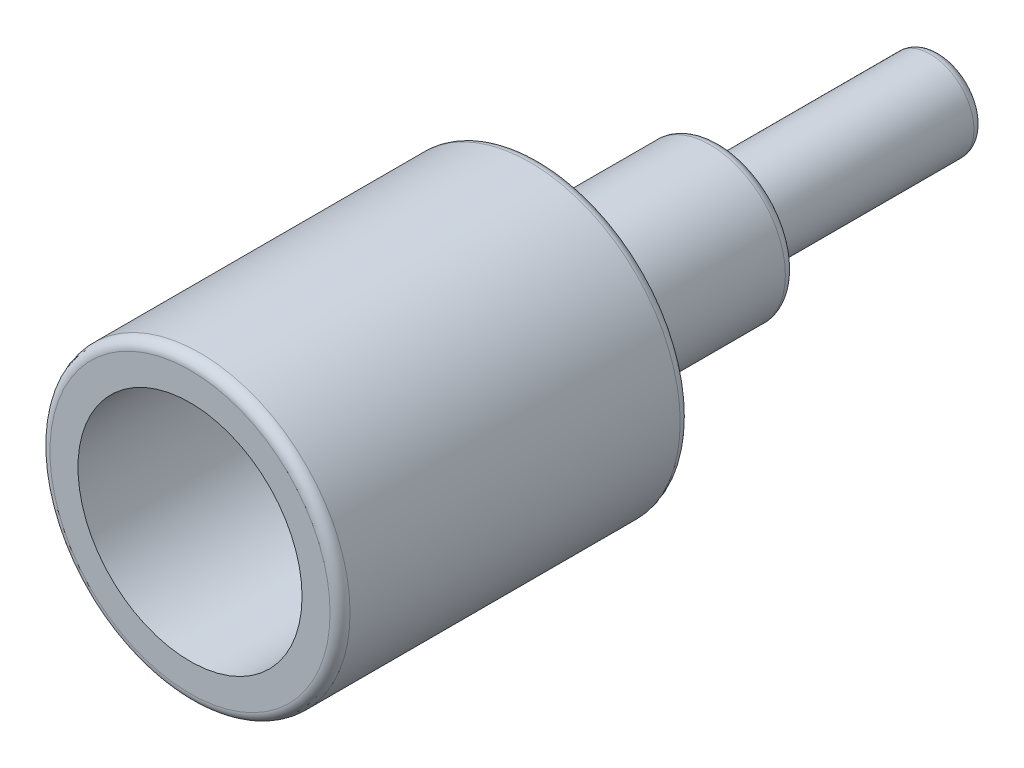
ISO-10303-21;
HEADER;
FILE_DESCRIPTION(('STEP AP214'),'2;1');
FILE_NAME('part.step','',(''),(''),'','','');
FILE_SCHEMA(('AUTOMOTIVE_DESIGN { 1 0 10303 214 1 1 1 1 }'));
ENDSEC;
DATA;
#1=APPLICATION_CONTEXT('core data for automotive mechanical design processes');
#2=APPLICATION_PROTOCOL_DEFINITION('international standard','automotive_design',2000,#1);
#3=PRODUCT_CONTEXT('',#1,'mechanical');
#4=PRODUCT('Part','Part','',(#3));
#5=PRODUCT_RELATED_PRODUCT_CATEGORY('part','',(#4));
#6=PRODUCT_DEFINITION_FORMATION('','',#4);
#7=PRODUCT_DEFINITION_CONTEXT('part definition',#1,'design');
#8=PRODUCT_DEFINITION('design','',#6,#7);
#9=PRODUCT_DEFINITION_SHAPE('','',#8);
#10=(LENGTH_UNIT() NAMED_UNIT(*) SI_UNIT(.MILLI.,.METRE.));
#11=(NAMED_UNIT(*) PLANE_ANGLE_UNIT() SI_UNIT($,.RADIAN.));
#12=(NAMED_UNIT(*) SI_UNIT($,.STERADIAN.) SOLID_ANGLE_UNIT());
#13=UNCERTAINTY_MEASURE_WITH_UNIT(LENGTH_MEASURE(1.E-05),#10,'distance_accuracy_value','');
#14=(GEOMETRIC_REPRESENTATION_CONTEXT(3) GLOBAL_UNCERTAINTY_ASSIGNED_CONTEXT((#13)) GLOBAL_UNIT_ASSIGNED_CONTEXT((#10,
#11,#12)) REPRESENTATION_CONTEXT('',''));
#15=CARTESIAN_POINT('',(0.,0.,0.));
#16=DIRECTION('',(0.,0.,1.));
#17=DIRECTION('',(1.,0.,0.));
#18=AXIS2_PLACEMENT_3D('',#15,#16,#17);
#19=CARTESIAN_POINT('',(0.,0.,3.5));
#20=DIRECTION('',(0.,0.,-1.));
#21=DIRECTION('',(-1.,0.,0.));
#22=AXIS2_PLACEMENT_3D('',#19,#20,#21);
#23=CYLINDRICAL_SURFACE('',#22,1.5);
#24=CARTESIAN_POINT('',(0.,0.,3.4));
#25=DIRECTION('',(0.,0.,1.));
#26=DIRECTION('',(1.,0.,0.));
#27=AXIS2_PLACEMENT_3D('',#24,#25,#26);
#28=CIRCLE('',#27,1.5);
#29=CARTESIAN_POINT('',(1.5,0.,3.4));
#30=VERTEX_POINT('',#29);
#31=EDGE_CURVE('E81',#30,#30,#28,.F.);
#32=ORIENTED_EDGE('',*,*,#31,.T.);
#33=EDGE_LOOP('',(#32));
#34=FACE_BOUND('',#33,.T.);
#35=CARTESIAN_POINT('',(0.,0.,0.0999999999999998));
#36=DIRECTION('',(0.,0.,1.));
#37=DIRECTION('',(1.,0.,0.));
#38=AXIS2_PLACEMENT_3D('',#35,#36,#37);
#39=CIRCLE('',#38,1.5);
#40=CARTESIAN_POINT('',(1.5,0.,0.0999999999999998));
#41=VERTEX_POINT('',#40);
#42=EDGE_CURVE('E85',#41,#41,#39,.T.);
#43=ORIENTED_EDGE('',*,*,#42,.T.);
#44=EDGE_LOOP('',(#43));
#45=FACE_BOUND('',#44,.T.);
#46=ADVANCED_FACE('F37',(#34,#45),#23,.T.);
#47=CARTESIAN_POINT('',(0.,0.,3.5));
#48=DIRECTION('',(0.,0.,1.));
#49=DIRECTION('',(1.,0.,0.));
#50=AXIS2_PLACEMENT_3D('',#47,#48,#49);
#51=PLANE('',#50);
#52=CARTESIAN_POINT('',(0.,0.,3.5));
#53=DIRECTION('',(0.,0.,1.));
#54=DIRECTION('',(1.,0.,0.));
#55=AXIS2_PLACEMENT_3D('',#52,#53,#54);
#56=CIRCLE('',#55,1.4);
#57=CARTESIAN_POINT('',(1.4,0.,3.5));
#58=VERTEX_POINT('',#57);
#59=EDGE_CURVE('E89',#58,#58,#56,.T.);
#60=ORIENTED_EDGE('',*,*,#59,.T.);
#61=EDGE_LOOP('',(#60));
#62=FACE_BOUND('',#61,.T.);
#63=CARTESIAN_POINT('',(0.,0.,3.5));
#64=DIRECTION('',(0.,0.,1.));
#65=DIRECTION('',(1.,0.,0.));
#66=AXIS2_PLACEMENT_3D('',#63,#64,#65);
#67=CIRCLE('',#66,1.12);
#68=CARTESIAN_POINT('',(1.12,0.,3.5));
#69=VERTEX_POINT('',#68);
#70=EDGE_CURVE('E94',#69,#69,#67,.T.);
#71=ORIENTED_EDGE('',*,*,#70,.F.);
#72=EDGE_LOOP('',(#71));
#73=FACE_BOUND('',#72,.T.);
#74=ADVANCED_FACE('F111',(#62,#73),#51,.T.);
#75=CARTESIAN_POINT('',(0.,0.,0.));
#76=DIRECTION('',(0.,0.,1.));
#77=DIRECTION('',(1.,0.,0.));
#78=AXIS2_PLACEMENT_3D('',#75,#76,#77);
#79=PLANE('',#78);
#80=CARTESIAN_POINT('',(0.,0.,0.));
#81=DIRECTION('',(0.,0.,1.));
#82=DIRECTION('',(1.,0.,0.));
#83=AXIS2_PLACEMENT_3D('',#80,#81,#82);
#84=CIRCLE('',#83,1.4);
#85=CARTESIAN_POINT('',(1.4,0.,0.));
#86=VERTEX_POINT('',#85);
#87=EDGE_CURVE('E10',#86,#86,#84,.F.);
#88=ORIENTED_EDGE('',*,*,#87,.T.);
#89=EDGE_LOOP('',(#88));
#90=FACE_BOUND('',#89,.T.);
#91=CARTESIAN_POINT('',(0.,0.,0.));
#92=DIRECTION('',(0.,0.,1.));
#93=DIRECTION('',(1.,0.,0.));
#94=AXIS2_PLACEMENT_3D('',#91,#92,#93);
#95=CIRCLE('',#94,0.8515);
#96=CARTESIAN_POINT('',(0.8515,0.,0.));
#97=VERTEX_POINT('',#96);
#98=EDGE_CURVE('E45',#97,#97,#95,.T.);
#99=ORIENTED_EDGE('',*,*,#98,.T.);
#100=EDGE_LOOP('',(#99));
#101=FACE_BOUND('',#100,.T.);
#102=ADVANCED_FACE('F107',(#90,#101),#79,.F.);
#103=CARTESIAN_POINT('',(0.,0.,0.5));
#104=DIRECTION('',(0.,0.,1.));
#105=DIRECTION('',(1.,0.,0.));
#106=AXIS2_PLACEMENT_3D('',#103,#104,#105);
#107=CYLINDRICAL_SURFACE('',#106,1.12);
#108=CARTESIAN_POINT('',(0.,0.,0.5));
#109=DIRECTION('',(0.,0.,1.));
#110=DIRECTION('',(1.,0.,0.));
#111=AXIS2_PLACEMENT_3D('',#108,#109,#110);
#112=CIRCLE('',#111,1.12);
#113=CARTESIAN_POINT('',(1.12,0.,0.5));
#114=VERTEX_POINT('',#113);
#115=EDGE_CURVE('E93',#114,#114,#112,.T.);
#116=ORIENTED_EDGE('',*,*,#115,.F.);
#117=EDGE_LOOP('',(#116));
#118=FACE_BOUND('',#117,.T.);
#119=ORIENTED_EDGE('',*,*,#70,.T.);
#120=EDGE_LOOP('',(#119));
#121=FACE_BOUND('',#120,.T.);
#122=ADVANCED_FACE('F104',(#118,#121),#107,.F.);
#123=CARTESIAN_POINT('',(0.,0.,0.5));
#124=DIRECTION('',(0.,0.,1.));
#125=DIRECTION('',(1.,0.,0.));
#126=AXIS2_PLACEMENT_3D('',#123,#124,#125);
#127=PLANE('',#126);
#128=ORIENTED_EDGE('',*,*,#115,.T.);
#129=EDGE_LOOP('',(#128));
#130=FACE_BOUND('',#129,.T.);
#131=ADVANCED_FACE('F102',(#130),#127,.T.);
#132=CARTESIAN_POINT('',(0.,0.,-1.8));
#133=DIRECTION('',(0.,0.,1.));
#134=DIRECTION('',(1.,0.,0.));
#135=AXIS2_PLACEMENT_3D('',#132,#133,#134);
#136=CYLINDRICAL_SURFACE('',#135,0.7515);
#137=CARTESIAN_POINT('',(0.,0.,-1.7));
#138=DIRECTION('',(0.,0.,-1.));
#139=DIRECTION('',(-1.,0.,0.));
#140=AXIS2_PLACEMENT_3D('',#137,#138,#139);
#141=CIRCLE('',#140,0.7515);
#142=CARTESIAN_POINT('',(-0.7515,0.,-1.7));
#143=VERTEX_POINT('',#142);
#144=EDGE_CURVE('E50',#143,#143,#141,.F.);
#145=ORIENTED_EDGE('',*,*,#144,.T.);
#146=EDGE_LOOP('',(#145));
#147=FACE_BOUND('',#146,.T.);
#148=CARTESIAN_POINT('',(0.,0.,-0.1));
#149=DIRECTION('',(0.,0.,1.));
#150=DIRECTION('',(1.,0.,0.));
#151=AXIS2_PLACEMENT_3D('',#148,#149,#150);
#152=CIRCLE('',#151,0.7515);
#153=CARTESIAN_POINT('',(0.7515,0.,-0.1));
#154=VERTEX_POINT('',#153);
#155=EDGE_CURVE('E55',#154,#154,#152,.F.);
#156=ORIENTED_EDGE('',*,*,#155,.T.);
#157=EDGE_LOOP('',(#156));
#158=FACE_BOUND('',#157,.T.);
#159=ADVANCED_FACE('F162',(#147,#158),#136,.T.);
#160=CARTESIAN_POINT('',(0.,0.,-1.8));
#161=DIRECTION('',(0.,0.,-1.));
#162=DIRECTION('',(-1.,0.,0.));
#163=AXIS2_PLACEMENT_3D('',#160,#161,#162);
#164=PLANE('',#163);
#165=CARTESIAN_POINT('',(0.,0.,-1.8));
#166=DIRECTION('',(0.,0.,-1.));
#167=DIRECTION('',(-1.,0.,0.));
#168=AXIS2_PLACEMENT_3D('',#165,#166,#167);
#169=CIRCLE('',#168,0.6515);
#170=CARTESIAN_POINT('',(-0.6515,0.,-1.8));
#171=VERTEX_POINT('',#170);
#172=EDGE_CURVE('E61',#171,#171,#169,.T.);
#173=ORIENTED_EDGE('',*,*,#172,.T.);
#174=EDGE_LOOP('',(#173));
#175=FACE_BOUND('',#174,.T.);
#176=CARTESIAN_POINT('',(0.,0.,-1.8));
#177=DIRECTION('',(0.,0.,-1.));
#178=DIRECTION('',(-1.,0.,0.));
#179=AXIS2_PLACEMENT_3D('',#176,#177,#178);
#180=CIRCLE('',#179,0.5365);
#181=CARTESIAN_POINT('',(-0.5365,0.,-1.8));
#182=VERTEX_POINT('',#181);
#183=EDGE_CURVE('E65',#182,#182,#180,.F.);
#184=ORIENTED_EDGE('',*,*,#183,.T.);
#185=EDGE_LOOP('',(#184));
#186=FACE_BOUND('',#185,.T.);
#187=ADVANCED_FACE('F153',(#175,#186),#164,.T.);
#188=CARTESIAN_POINT('',(0.,0.,-4.));
#189=DIRECTION('',(0.,0.,1.));
#190=DIRECTION('',(1.,0.,0.));
#191=AXIS2_PLACEMENT_3D('',#188,#189,#190);
#192=CYLINDRICAL_SURFACE('',#191,0.4365);
#193=CARTESIAN_POINT('',(0.,0.,-3.9));
#194=DIRECTION('',(0.,0.,-1.));
#195=DIRECTION('',(-1.,0.,0.));
#196=AXIS2_PLACEMENT_3D('',#193,#194,#195);
#197=CIRCLE('',#196,0.4365);
#198=CARTESIAN_POINT('',(-0.4365,0.,-3.9));
#199=VERTEX_POINT('',#198);
#200=EDGE_CURVE('E69',#199,#199,#197,.F.);
#201=ORIENTED_EDGE('',*,*,#200,.T.);
#202=EDGE_LOOP('',(#201));
#203=FACE_BOUND('',#202,.T.);
#204=CARTESIAN_POINT('',(0.,0.,-1.9));
#205=DIRECTION('',(0.,0.,-1.));
#206=DIRECTION('',(-1.,0.,0.));
#207=AXIS2_PLACEMENT_3D('',#204,#205,#206);
#208=CIRCLE('',#207,0.4365);
#209=CARTESIAN_POINT('',(-0.4365,0.,-1.9));
#210=VERTEX_POINT('',#209);
#211=EDGE_CURVE('E73',#210,#210,#208,.T.);
#212=ORIENTED_EDGE('',*,*,#211,.T.);
#213=EDGE_LOOP('',(#212));
#214=FACE_BOUND('',#213,.T.);
#215=ADVANCED_FACE('F151',(#203,#214),#192,.T.);
#216=CARTESIAN_POINT('',(0.,0.,-4.));
#217=DIRECTION('',(0.,0.,-1.));
#218=DIRECTION('',(-1.,0.,0.));
#219=AXIS2_PLACEMENT_3D('',#216,#217,#218);
#220=PLANE('',#219);
#221=CARTESIAN_POINT('',(0.,0.,-4.));
#222=DIRECTION('',(0.,0.,-1.));
#223=DIRECTION('',(-1.,0.,0.));
#224=AXIS2_PLACEMENT_3D('',#221,#222,#223);
#225=CIRCLE('',#224,0.3365);
#226=CARTESIAN_POINT('',(-0.3365,0.,-4.));
#227=VERTEX_POINT('',#226);
#228=EDGE_CURVE('E77',#227,#227,#225,.T.);
#229=ORIENTED_EDGE('',*,*,#228,.T.);
#230=EDGE_LOOP('',(#229));
#231=FACE_BOUND('',#230,.T.);
#232=ADVANCED_FACE('F128',(#231),#220,.T.);
#233=CARTESIAN_POINT('',(0.,0.,3.4));
#234=DIRECTION('',(0.,0.,1.));
#235=DIRECTION('',(1.,0.,0.));
#236=AXIS2_PLACEMENT_3D('',#233,#234,#235);
#237=TOROIDAL_SURFACE('',#236,1.4,0.1);
#238=ORIENTED_EDGE('',*,*,#31,.F.);
#239=EDGE_LOOP('',(#238));
#240=FACE_BOUND('',#239,.T.);
#241=ORIENTED_EDGE('',*,*,#59,.F.);
#242=EDGE_LOOP('',(#241));
#243=FACE_BOUND('',#242,.T.);
#244=ADVANCED_FACE('F124',(#240,#243),#237,.T.);
#245=CARTESIAN_POINT('',(0.,0.,-3.9));
#246=DIRECTION('',(0.,0.,-1.));
#247=DIRECTION('',(-1.,0.,0.));
#248=AXIS2_PLACEMENT_3D('',#245,#246,#247);
#249=TOROIDAL_SURFACE('',#248,0.3365,0.1);
#250=ORIENTED_EDGE('',*,*,#200,.F.);
#251=EDGE_LOOP('',(#250));
#252=FACE_BOUND('',#251,.T.);
#253=ORIENTED_EDGE('',*,*,#228,.F.);
#254=EDGE_LOOP('',(#253));
#255=FACE_BOUND('',#254,.T.);
#256=ADVANCED_FACE('F127',(#252,#255),#249,.T.);
#257=CARTESIAN_POINT('',(0.,0.,-1.7));
#258=DIRECTION('',(0.,0.,-1.));
#259=DIRECTION('',(-1.,0.,0.));
#260=AXIS2_PLACEMENT_3D('',#257,#258,#259);
#261=TOROIDAL_SURFACE('',#260,0.6515,0.1);
#262=ORIENTED_EDGE('',*,*,#144,.F.);
#263=EDGE_LOOP('',(#262));
#264=FACE_BOUND('',#263,.T.);
#265=ORIENTED_EDGE('',*,*,#172,.F.);
#266=EDGE_LOOP('',(#265));
#267=FACE_BOUND('',#266,.T.);
#268=ADVANCED_FACE('F132',(#264,#267),#261,.T.);
#269=CARTESIAN_POINT('',(0.,0.,0.0999999999999998));
#270=DIRECTION('',(0.,0.,1.));
#271=DIRECTION('',(1.,0.,0.));
#272=AXIS2_PLACEMENT_3D('',#269,#270,#271);
#273=TOROIDAL_SURFACE('',#272,1.4,0.1);
#274=ORIENTED_EDGE('',*,*,#87,.F.);
#275=EDGE_LOOP('',(#274));
#276=FACE_BOUND('',#275,.T.);
#277=ORIENTED_EDGE('',*,*,#42,.F.);
#278=EDGE_LOOP('',(#277));
#279=FACE_BOUND('',#278,.T.);
#280=ADVANCED_FACE('F136',(#276,#279),#273,.T.);
#281=CARTESIAN_POINT('',(0.,0.,-1.9));
#282=DIRECTION('',(0.,0.,-1.));
#283=DIRECTION('',(-1.,0.,0.));
#284=AXIS2_PLACEMENT_3D('',#281,#282,#283);
#285=TOROIDAL_SURFACE('',#284,0.5365,0.1);
#286=ORIENTED_EDGE('',*,*,#183,.F.);
#287=EDGE_LOOP('',(#286));
#288=FACE_BOUND('',#287,.T.);
#289=ORIENTED_EDGE('',*,*,#211,.F.);
#290=EDGE_LOOP('',(#289));
#291=FACE_BOUND('',#290,.T.);
#292=ADVANCED_FACE('F139',(#288,#291),#285,.F.);
#293=CARTESIAN_POINT('',(0.,0.,-0.1));
#294=DIRECTION('',(0.,0.,1.));
#295=DIRECTION('',(1.,0.,0.));
#296=AXIS2_PLACEMENT_3D('',#293,#294,#295);
#297=TOROIDAL_SURFACE('',#296,0.8515,0.1);
#298=ORIENTED_EDGE('',*,*,#98,.F.);
#299=EDGE_LOOP('',(#298));
#300=FACE_BOUND('',#299,.T.);
#301=ORIENTED_EDGE('',*,*,#155,.F.);
#302=EDGE_LOOP('',(#301));
#303=FACE_BOUND('',#302,.T.);
#304=ADVANCED_FACE('F39',(#300,#303),#297,.F.);
#305=CLOSED_SHELL('',(#46,#74,#102,#122,#131,#159,#187,#215,#232,#244,#256,#268,#280,#292,#304));
#306=MANIFOLD_SOLID_BREP('B2',#305);
#307=ADVANCED_BREP_SHAPE_REPRESENTATION('',(#18,#306),#14);
#308=SHAPE_DEFINITION_REPRESENTATION(#9,#307);
ENDSEC;
END-ISO-10303-21;
